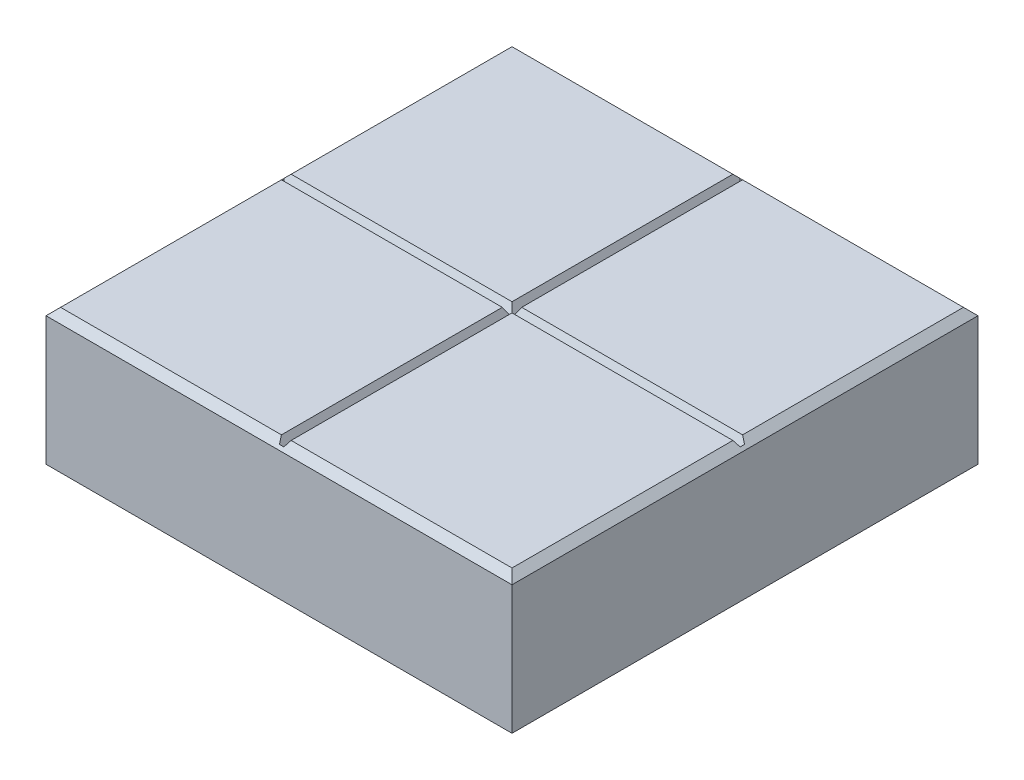
ISO-10303-21;
HEADER;
FILE_DESCRIPTION(('STEP AP214'),'2;1');
FILE_NAME('part.step','',(''),(''),'','','');
FILE_SCHEMA(('AUTOMOTIVE_DESIGN { 1 0 10303 214 1 1 1 1 }'));
ENDSEC;
DATA;
#1=APPLICATION_CONTEXT('core data for automotive mechanical design processes');
#2=APPLICATION_PROTOCOL_DEFINITION('international standard','automotive_design',2000,#1);
#3=PRODUCT_CONTEXT('',#1,'mechanical');
#4=PRODUCT('Part','Part','',(#3));
#5=PRODUCT_RELATED_PRODUCT_CATEGORY('part','',(#4));
#6=PRODUCT_DEFINITION_FORMATION('','',#4);
#7=PRODUCT_DEFINITION_CONTEXT('part definition',#1,'design');
#8=PRODUCT_DEFINITION('design','',#6,#7);
#9=PRODUCT_DEFINITION_SHAPE('','',#8);
#10=(LENGTH_UNIT() NAMED_UNIT(*) SI_UNIT(.MILLI.,.METRE.));
#11=(NAMED_UNIT(*) PLANE_ANGLE_UNIT() SI_UNIT($,.RADIAN.));
#12=(NAMED_UNIT(*) SI_UNIT($,.STERADIAN.) SOLID_ANGLE_UNIT());
#13=UNCERTAINTY_MEASURE_WITH_UNIT(LENGTH_MEASURE(1.E-05),#10,'distance_accuracy_value','');
#14=(GEOMETRIC_REPRESENTATION_CONTEXT(3) GLOBAL_UNCERTAINTY_ASSIGNED_CONTEXT((#13)) GLOBAL_UNIT_ASSIGNED_CONTEXT((#10,
#11,#12)) REPRESENTATION_CONTEXT('',''));
#15=CARTESIAN_POINT('',(0.,0.,0.));
#16=DIRECTION('',(0.,0.,1.));
#17=DIRECTION('',(1.,0.,0.));
#18=AXIS2_PLACEMENT_3D('',#15,#16,#17);
#19=CARTESIAN_POINT('',(0.,70.,0.));
#20=DIRECTION('',(0.,-1.,0.));
#21=DIRECTION('',(0.,0.,-1.));
#22=AXIS2_PLACEMENT_3D('',#19,#20,#21);
#23=PLANE('',#22);
#24=DIRECTION('',(0.,0.,1.));
#25=VECTOR('',#24,1.);
#26=CARTESIAN_POINT('',(116.25,70.,-130.));
#27=LINE('',#26,#25);
#28=CARTESIAN_POINT('',(116.25,70.,-116.249999999999));
#29=VERTEX_POINT('',#28);
#30=CARTESIAN_POINT('',(116.25,70.,-2.5));
#31=VERTEX_POINT('',#30);
#32=EDGE_CURVE('E203',#29,#31,#27,.T.);
#33=ORIENTED_EDGE('',*,*,#32,.F.);
#34=DIRECTION('',(1.,0.,0.));
#35=VECTOR('',#34,1.);
#36=CARTESIAN_POINT('',(-130.,70.,-116.25));
#37=LINE('',#36,#35);
#38=CARTESIAN_POINT('',(2.5,70.,-116.25));
#39=VERTEX_POINT('',#38);
#40=EDGE_CURVE('E390',#39,#29,#37,.T.);
#41=ORIENTED_EDGE('',*,*,#40,.F.);
#42=DIRECTION('',(0.,0.,-1.));
#43=VECTOR('',#42,1.);
#44=CARTESIAN_POINT('',(2.5,70.,0.));
#45=LINE('',#44,#43);
#46=CARTESIAN_POINT('',(2.5,70.,-2.5));
#47=VERTEX_POINT('',#46);
#48=EDGE_CURVE('E318',#47,#39,#45,.T.);
#49=ORIENTED_EDGE('',*,*,#48,.F.);
#50=DIRECTION('',(1.,0.,0.));
#51=VECTOR('',#50,1.);
#52=CARTESIAN_POINT('',(0.,70.,-2.5));
#53=LINE('',#52,#51);
#54=EDGE_CURVE('E325',#47,#31,#53,.T.);
#55=ORIENTED_EDGE('',*,*,#54,.T.);
#56=EDGE_LOOP('',(#33,#41,#49,#55));
#57=FACE_BOUND('',#56,.T.);
#58=ADVANCED_FACE('F44',(#57),#23,.F.);
#59=DIRECTION('',(0.,0.,-1.));
#60=VECTOR('',#59,1.);
#61=CARTESIAN_POINT('',(-116.25,70.,130.));
#62=LINE('',#61,#60);
#63=CARTESIAN_POINT('',(-116.25,70.,116.249999999999));
#64=VERTEX_POINT('',#63);
#65=CARTESIAN_POINT('',(-116.25,70.,2.5));
#66=VERTEX_POINT('',#65);
#67=EDGE_CURVE('E245',#64,#66,#62,.T.);
#68=ORIENTED_EDGE('',*,*,#67,.F.);
#69=DIRECTION('',(-1.,0.,0.));
#70=VECTOR('',#69,1.);
#71=CARTESIAN_POINT('',(129.999999999999,70.,116.250000000001));
#72=LINE('',#71,#70);
#73=CARTESIAN_POINT('',(-2.49999999999996,70.,116.25));
#74=VERTEX_POINT('',#73);
#75=EDGE_CURVE('E60',#74,#64,#72,.T.);
#76=ORIENTED_EDGE('',*,*,#75,.F.);
#77=DIRECTION('',(0.,0.,-1.));
#78=VECTOR('',#77,1.);
#79=CARTESIAN_POINT('',(-2.5,70.,0.));
#80=LINE('',#79,#78);
#81=CARTESIAN_POINT('',(-2.5,70.,2.5));
#82=VERTEX_POINT('',#81);
#83=EDGE_CURVE('E336',#74,#82,#80,.T.);
#84=ORIENTED_EDGE('',*,*,#83,.T.);
#85=DIRECTION('',(1.,0.,0.));
#86=VECTOR('',#85,1.);
#87=CARTESIAN_POINT('',(0.,70.,2.5));
#88=LINE('',#87,#86);
#89=EDGE_CURVE('E339',#66,#82,#88,.T.);
#90=ORIENTED_EDGE('',*,*,#89,.F.);
#91=EDGE_LOOP('',(#68,#76,#84,#90));
#92=FACE_BOUND('',#91,.T.);
#93=ADVANCED_FACE('F449',(#92),#23,.F.);
#94=DIRECTION('',(0.,0.,-1.));
#95=VECTOR('',#94,1.);
#96=CARTESIAN_POINT('',(-2.5,70.,0.));
#97=LINE('',#96,#95);
#98=CARTESIAN_POINT('',(-2.5,70.,-2.5));
#99=VERTEX_POINT('',#98);
#100=CARTESIAN_POINT('',(-2.5,70.,-116.25));
#101=VERTEX_POINT('',#100);
#102=EDGE_CURVE('E346',#99,#101,#97,.T.);
#103=ORIENTED_EDGE('',*,*,#102,.T.);
#104=CARTESIAN_POINT('',(-116.25,70.,-116.25));
#105=VERTEX_POINT('',#104);
#106=EDGE_CURVE('E389',#105,#101,#37,.T.);
#107=ORIENTED_EDGE('',*,*,#106,.F.);
#108=CARTESIAN_POINT('',(-116.25,70.,-2.5));
#109=VERTEX_POINT('',#108);
#110=EDGE_CURVE('E236',#109,#105,#62,.T.);
#111=ORIENTED_EDGE('',*,*,#110,.F.);
#112=DIRECTION('',(1.,0.,0.));
#113=VECTOR('',#112,1.);
#114=CARTESIAN_POINT('',(0.,70.,-2.5));
#115=LINE('',#114,#113);
#116=EDGE_CURVE('E343',#109,#99,#115,.T.);
#117=ORIENTED_EDGE('',*,*,#116,.T.);
#118=EDGE_LOOP('',(#103,#107,#111,#117));
#119=FACE_BOUND('',#118,.T.);
#120=ADVANCED_FACE('F455',(#119),#23,.F.);
#121=CARTESIAN_POINT('',(120.,70.,120.));
#122=DIRECTION('',(-1.,0.,0.));
#123=DIRECTION('',(0.,0.,1.));
#124=AXIS2_PLACEMENT_3D('',#121,#122,#123);
#125=PLANE('',#124);
#126=DIRECTION('',(0.,-1.,0.));
#127=VECTOR('',#126,1.);
#128=CARTESIAN_POINT('',(120.,70.,-120.));
#129=LINE('',#128,#127);
#130=CARTESIAN_POINT('',(120.,66.25,-120.));
#131=VERTEX_POINT('',#130);
#132=CARTESIAN_POINT('',(120.,0.,-120.));
#133=VERTEX_POINT('',#132);
#134=EDGE_CURVE('E200',#131,#133,#129,.T.);
#135=ORIENTED_EDGE('',*,*,#134,.F.);
#136=DIRECTION('',(0.,0.,-1.));
#137=VECTOR('',#136,1.);
#138=CARTESIAN_POINT('',(120.,66.25,-130.));
#139=LINE('',#138,#137);
#140=CARTESIAN_POINT('',(120.,66.25,120.000000000001));
#141=VERTEX_POINT('',#140);
#142=EDGE_CURVE('E189',#141,#131,#139,.T.);
#143=ORIENTED_EDGE('',*,*,#142,.F.);
#144=DIRECTION('',(0.,-1.,0.));
#145=VECTOR('',#144,1.);
#146=CARTESIAN_POINT('',(120.,70.,120.));
#147=LINE('',#146,#145);
#148=CARTESIAN_POINT('',(120.,0.,120.));
#149=VERTEX_POINT('',#148);
#150=EDGE_CURVE('E198',#141,#149,#147,.T.);
#151=ORIENTED_EDGE('',*,*,#150,.T.);
#152=DIRECTION('',(0.,0.,-1.));
#153=VECTOR('',#152,1.);
#154=CARTESIAN_POINT('',(120.,0.,120.));
#155=LINE('',#154,#153);
#156=EDGE_CURVE('E255',#149,#133,#155,.T.);
#157=ORIENTED_EDGE('',*,*,#156,.T.);
#158=EDGE_LOOP('',(#135,#143,#151,#157));
#159=FACE_BOUND('',#158,.T.);
#160=ADVANCED_FACE('F46',(#159),#125,.F.);
#161=CARTESIAN_POINT('',(-120.,70.,-120.));
#162=DIRECTION('',(0.,0.,1.));
#163=DIRECTION('',(1.,0.,0.));
#164=AXIS2_PLACEMENT_3D('',#161,#162,#163);
#165=PLANE('',#164);
#166=DIRECTION('',(0.,-1.,0.));
#167=VECTOR('',#166,1.);
#168=CARTESIAN_POINT('',(-120.,70.,-120.));
#169=LINE('',#168,#167);
#170=CARTESIAN_POINT('',(-120.,66.25,-120.));
#171=VERTEX_POINT('',#170);
#172=CARTESIAN_POINT('',(-120.,0.,-120.));
#173=VERTEX_POINT('',#172);
#174=EDGE_CURVE('E214',#171,#173,#169,.T.);
#175=ORIENTED_EDGE('',*,*,#174,.F.);
#176=DIRECTION('',(-1.,0.,0.));
#177=VECTOR('',#176,1.);
#178=CARTESIAN_POINT('',(-130.,66.25,-120.));
#179=LINE('',#178,#177);
#180=EDGE_CURVE('E249',#131,#171,#179,.T.);
#181=ORIENTED_EDGE('',*,*,#180,.F.);
#182=ORIENTED_EDGE('',*,*,#134,.T.);
#183=DIRECTION('',(-1.,0.,0.));
#184=VECTOR('',#183,1.);
#185=CARTESIAN_POINT('',(-120.,0.,-120.));
#186=LINE('',#185,#184);
#187=EDGE_CURVE('E251',#133,#173,#186,.T.);
#188=ORIENTED_EDGE('',*,*,#187,.T.);
#189=EDGE_LOOP('',(#175,#181,#182,#188));
#190=FACE_BOUND('',#189,.T.);
#191=ADVANCED_FACE('F248',(#190),#165,.F.);
#192=CARTESIAN_POINT('',(-120.,70.,120.));
#193=DIRECTION('',(1.,0.,0.));
#194=DIRECTION('',(0.,0.,-1.));
#195=AXIS2_PLACEMENT_3D('',#192,#193,#194);
#196=PLANE('',#195);
#197=DIRECTION('',(0.,-1.,0.));
#198=VECTOR('',#197,1.);
#199=CARTESIAN_POINT('',(-120.,70.,120.));
#200=LINE('',#199,#198);
#201=CARTESIAN_POINT('',(-120.,66.25,119.999999999999));
#202=VERTEX_POINT('',#201);
#203=CARTESIAN_POINT('',(-120.,0.,120.));
#204=VERTEX_POINT('',#203);
#205=EDGE_CURVE('E210',#202,#204,#200,.T.);
#206=ORIENTED_EDGE('',*,*,#205,.F.);
#207=DIRECTION('',(0.,0.,1.));
#208=VECTOR('',#207,1.);
#209=CARTESIAN_POINT('',(-120.,66.25,130.));
#210=LINE('',#209,#208);
#211=EDGE_CURVE('E233',#171,#202,#210,.T.);
#212=ORIENTED_EDGE('',*,*,#211,.F.);
#213=ORIENTED_EDGE('',*,*,#174,.T.);
#214=DIRECTION('',(0.,0.,1.));
#215=VECTOR('',#214,1.);
#216=CARTESIAN_POINT('',(-120.,0.,120.));
#217=LINE('',#216,#215);
#218=EDGE_CURVE('E216',#173,#204,#217,.T.);
#219=ORIENTED_EDGE('',*,*,#218,.T.);
#220=EDGE_LOOP('',(#206,#212,#213,#219));
#221=FACE_BOUND('',#220,.T.);
#222=ADVANCED_FACE('F241',(#221),#196,.F.);
#223=CARTESIAN_POINT('',(-120.,70.,120.));
#224=DIRECTION('',(0.,0.,-1.));
#225=DIRECTION('',(-1.,0.,0.));
#226=AXIS2_PLACEMENT_3D('',#223,#224,#225);
#227=PLANE('',#226);
#228=ORIENTED_EDGE('',*,*,#150,.F.);
#229=DIRECTION('',(1.,0.,0.));
#230=VECTOR('',#229,1.);
#231=CARTESIAN_POINT('',(129.999999999999,66.25,120.000000000001));
#232=LINE('',#231,#230);
#233=EDGE_CURVE('E172',#202,#141,#232,.T.);
#234=ORIENTED_EDGE('',*,*,#233,.F.);
#235=ORIENTED_EDGE('',*,*,#205,.T.);
#236=DIRECTION('',(1.,0.,0.));
#237=VECTOR('',#236,1.);
#238=CARTESIAN_POINT('',(-120.,0.,120.));
#239=LINE('',#238,#237);
#240=EDGE_CURVE('E207',#204,#149,#239,.T.);
#241=ORIENTED_EDGE('',*,*,#240,.T.);
#242=EDGE_LOOP('',(#228,#234,#235,#241));
#243=FACE_BOUND('',#242,.T.);
#244=ADVANCED_FACE('F205',(#243),#227,.F.);
#245=DIRECTION('',(0.,0.,-1.));
#246=VECTOR('',#245,1.);
#247=CARTESIAN_POINT('',(2.5,70.,0.));
#248=LINE('',#247,#246);
#249=CARTESIAN_POINT('',(2.5,70.,116.25));
#250=VERTEX_POINT('',#249);
#251=CARTESIAN_POINT('',(2.5,70.,2.5));
#252=VERTEX_POINT('',#251);
#253=EDGE_CURVE('E333',#250,#252,#248,.T.);
#254=ORIENTED_EDGE('',*,*,#253,.F.);
#255=CARTESIAN_POINT('',(116.25,70.,116.250000000001));
#256=VERTEX_POINT('',#255);
#257=EDGE_CURVE('E182',#256,#250,#72,.T.);
#258=ORIENTED_EDGE('',*,*,#257,.F.);
#259=CARTESIAN_POINT('',(116.25,70.,2.49999999999997));
#260=VERTEX_POINT('',#259);
#261=EDGE_CURVE('E192',#260,#256,#27,.T.);
#262=ORIENTED_EDGE('',*,*,#261,.F.);
#263=DIRECTION('',(1.,0.,0.));
#264=VECTOR('',#263,1.);
#265=CARTESIAN_POINT('',(0.,70.,2.5));
#266=LINE('',#265,#264);
#267=EDGE_CURVE('E329',#252,#260,#266,.T.);
#268=ORIENTED_EDGE('',*,*,#267,.F.);
#269=EDGE_LOOP('',(#254,#258,#262,#268));
#270=FACE_BOUND('',#269,.T.);
#271=ADVANCED_FACE('F406',(#270),#23,.F.);
#272=CARTESIAN_POINT('',(0.,0.,0.));
#273=DIRECTION('',(0.,-1.,0.));
#274=DIRECTION('',(0.,0.,-1.));
#275=AXIS2_PLACEMENT_3D('',#272,#273,#274);
#276=PLANE('',#275);
#277=ORIENTED_EDGE('',*,*,#156,.F.);
#278=ORIENTED_EDGE('',*,*,#240,.F.);
#279=ORIENTED_EDGE('',*,*,#218,.F.);
#280=ORIENTED_EDGE('',*,*,#187,.F.);
#281=EDGE_LOOP('',(#277,#278,#279,#280));
#282=FACE_BOUND('',#281,.T.);
#283=ADVANCED_FACE('F257',(#282),#276,.T.);
#284=CARTESIAN_POINT('',(-2.5,70.,0.));
#285=DIRECTION('',(-0.866025403784438,-0.5,0.));
#286=DIRECTION('',(0.5,-0.866025403784438,0.));
#287=AXIS2_PLACEMENT_3D('',#284,#285,#286);
#288=PLANE('',#287);
#289=DIRECTION('',(-0.377964473009227,0.654653670707977,0.654653670707978));
#290=VECTOR('',#289,1.);
#291=CARTESIAN_POINT('',(-31.264415197126,119.821428571429,-66.4285714285713));
#292=LINE('',#291,#290);
#293=CARTESIAN_POINT('',(-1.12740473580836,67.6225952641917,-118.627404735808));
#294=VERTEX_POINT('',#293);
#295=EDGE_CURVE('E365',#101,#294,#292,.F.);
#296=ORIENTED_EDGE('',*,*,#295,.F.);
#297=ORIENTED_EDGE('',*,*,#102,.F.);
#298=DIRECTION('',(-0.447213595499958,0.774596669241483,-0.447213595499958));
#299=VECTOR('',#298,1.);
#300=CARTESIAN_POINT('',(-2.,69.1339745962156,-2.));
#301=LINE('',#300,#299);
#302=CARTESIAN_POINT('',(0.,65.6698729810778,0.));
#303=VERTEX_POINT('',#302);
#304=EDGE_CURVE('E314',#303,#99,#301,.T.);
#305=ORIENTED_EDGE('',*,*,#304,.F.);
#306=DIRECTION('',(0.,0.,1.));
#307=VECTOR('',#306,1.);
#308=CARTESIAN_POINT('',(0.,65.6698729810778,0.));
#309=LINE('',#308,#307);
#310=CARTESIAN_POINT('',(0.,65.6698729810778,-117.5));
#311=VERTEX_POINT('',#310);
#312=EDGE_CURVE('E271',#303,#311,#309,.F.);
#313=ORIENTED_EDGE('',*,*,#312,.T.);
#314=DIRECTION('',(0.447213595499958,-0.774596669241483,0.447213595499958));
#315=VECTOR('',#314,1.);
#316=CARTESIAN_POINT('',(21.5,28.430780618347,-95.9999999999999));
#317=LINE('',#316,#315);
#318=EDGE_CURVE('E274',#311,#294,#317,.F.);
#319=ORIENTED_EDGE('',*,*,#318,.T.);
#320=EDGE_LOOP('',(#296,#297,#305,#313,#319));
#321=FACE_BOUND('',#320,.T.);
#322=ADVANCED_FACE('F425',(#321),#288,.F.);
#323=CARTESIAN_POINT('',(0.,70.,-120.));
#324=DIRECTION('',(0.,-0.5,-0.866025403784438));
#325=DIRECTION('',(0.,0.866025403784438,-0.5));
#326=AXIS2_PLACEMENT_3D('',#323,#324,#325);
#327=PLANE('',#326);
#328=DIRECTION('',(0.447213595499958,0.774596669241483,-0.447213595499958));
#329=VECTOR('',#328,1.);
#330=CARTESIAN_POINT('',(-21.5,28.430780618347,-95.9999999999999));
#331=LINE('',#330,#329);
#332=CARTESIAN_POINT('',(1.12740473580834,67.6225952641916,-118.627404735808));
#333=VERTEX_POINT('',#332);
#334=EDGE_CURVE('E275',#311,#333,#331,.T.);
#335=ORIENTED_EDGE('',*,*,#334,.T.);
#336=DIRECTION('',(-1.,0.,0.));
#337=VECTOR('',#336,1.);
#338=CARTESIAN_POINT('',(0.,67.6225952641917,-118.627404735808));
#339=LINE('',#338,#337);
#340=EDGE_CURVE('E368',#333,#294,#339,.T.);
#341=ORIENTED_EDGE('',*,*,#340,.T.);
#342=ORIENTED_EDGE('',*,*,#318,.F.);
#343=EDGE_LOOP('',(#335,#341,#342));
#344=FACE_BOUND('',#343,.T.);
#345=ADVANCED_FACE('F477',(#344),#327,.F.);
#346=CARTESIAN_POINT('',(2.5,70.,0.));
#347=DIRECTION('',(0.866025403784438,-0.5,0.));
#348=DIRECTION('',(0.5,0.866025403784438,0.));
#349=AXIS2_PLACEMENT_3D('',#346,#347,#348);
#350=PLANE('',#349);
#351=ORIENTED_EDGE('',*,*,#48,.T.);
#352=DIRECTION('',(-0.377964473009227,-0.654653670707976,-0.654653670707979));
#353=VECTOR('',#352,1.);
#354=CARTESIAN_POINT('',(31.264415197126,119.821428571429,-66.4285714285711));
#355=LINE('',#354,#353);
#356=EDGE_CURVE('E372',#39,#333,#355,.T.);
#357=ORIENTED_EDGE('',*,*,#356,.T.);
#358=ORIENTED_EDGE('',*,*,#334,.F.);
#359=ORIENTED_EDGE('',*,*,#312,.F.);
#360=DIRECTION('',(-0.447213595499958,-0.774596669241483,0.447213595499958));
#361=VECTOR('',#360,1.);
#362=CARTESIAN_POINT('',(2.,69.1339745962156,-2.));
#363=LINE('',#362,#361);
#364=EDGE_CURVE('E279',#303,#47,#363,.F.);
#365=ORIENTED_EDGE('',*,*,#364,.T.);
#366=EDGE_LOOP('',(#351,#357,#358,#359,#365));
#367=FACE_BOUND('',#366,.T.);
#368=ADVANCED_FACE('F474',(#367),#350,.F.);
#369=CARTESIAN_POINT('',(0.,70.,-2.5));
#370=DIRECTION('',(0.,-0.5,-0.866025403784438));
#371=DIRECTION('',(0.,0.866025403784438,-0.5));
#372=AXIS2_PLACEMENT_3D('',#369,#370,#371);
#373=PLANE('',#372);
#374=DIRECTION('',(-0.654653670707978,0.654653670707976,-0.377964473009227));
#375=VECTOR('',#374,1.);
#376=CARTESIAN_POINT('',(66.4285714285712,119.821428571429,-31.264415197126));
#377=LINE('',#376,#375);
#378=CARTESIAN_POINT('',(118.627404735808,67.6225952641916,-1.12740473580832));
#379=VERTEX_POINT('',#378);
#380=EDGE_CURVE('E358',#31,#379,#377,.F.);
#381=ORIENTED_EDGE('',*,*,#380,.F.);
#382=ORIENTED_EDGE('',*,*,#54,.F.);
#383=ORIENTED_EDGE('',*,*,#364,.F.);
#384=DIRECTION('',(-1.,0.,0.));
#385=VECTOR('',#384,1.);
#386=CARTESIAN_POINT('',(0.,65.6698729810778,0.));
#387=LINE('',#386,#385);
#388=CARTESIAN_POINT('',(117.5,65.6698729810778,0.));
#389=VERTEX_POINT('',#388);
#390=EDGE_CURVE('E268',#303,#389,#387,.F.);
#391=ORIENTED_EDGE('',*,*,#390,.T.);
#392=DIRECTION('',(-0.447213595499958,-0.774596669241483,0.447213595499958));
#393=VECTOR('',#392,1.);
#394=CARTESIAN_POINT('',(96.,28.4307806183469,21.5));
#395=LINE('',#394,#393);
#396=EDGE_CURVE('E282',#389,#379,#395,.F.);
#397=ORIENTED_EDGE('',*,*,#396,.T.);
#398=EDGE_LOOP('',(#381,#382,#383,#391,#397));
#399=FACE_BOUND('',#398,.T.);
#400=ADVANCED_FACE('F417',(#399),#373,.F.);
#401=CARTESIAN_POINT('',(120.,70.,0.));
#402=DIRECTION('',(0.866025403784438,-0.5,0.));
#403=DIRECTION('',(0.5,0.866025403784438,0.));
#404=AXIS2_PLACEMENT_3D('',#401,#402,#403);
#405=PLANE('',#404);
#406=DIRECTION('',(0.447213595499958,0.774596669241483,0.447213595499958));
#407=VECTOR('',#406,1.);
#408=CARTESIAN_POINT('',(96.,28.4307806183469,-21.5));
#409=LINE('',#408,#407);
#410=CARTESIAN_POINT('',(118.627404735808,67.6225952641916,1.1274047358083));
#411=VERTEX_POINT('',#410);
#412=EDGE_CURVE('E286',#389,#411,#409,.T.);
#413=ORIENTED_EDGE('',*,*,#412,.T.);
#414=DIRECTION('',(0.,0.,-1.));
#415=VECTOR('',#414,1.);
#416=CARTESIAN_POINT('',(118.627404735808,67.6225952641916,0.));
#417=LINE('',#416,#415);
#418=EDGE_CURVE('E361',#411,#379,#417,.T.);
#419=ORIENTED_EDGE('',*,*,#418,.T.);
#420=ORIENTED_EDGE('',*,*,#396,.F.);
#421=EDGE_LOOP('',(#413,#419,#420));
#422=FACE_BOUND('',#421,.T.);
#423=ADVANCED_FACE('F498',(#422),#405,.F.);
#424=CARTESIAN_POINT('',(0.,70.,2.5));
#425=DIRECTION('',(0.,-0.5,0.866025403784438));
#426=DIRECTION('',(0.,-0.866025403784438,-0.5));
#427=AXIS2_PLACEMENT_3D('',#424,#425,#426);
#428=PLANE('',#427);
#429=ORIENTED_EDGE('',*,*,#267,.T.);
#430=DIRECTION('',(0.654653670707978,-0.654653670707976,-0.377964473009227));
#431=VECTOR('',#430,1.);
#432=CARTESIAN_POINT('',(66.4285714285712,119.821428571429,31.264415197126));
#433=LINE('',#432,#431);
#434=EDGE_CURVE('E11',#260,#411,#433,.T.);
#435=ORIENTED_EDGE('',*,*,#434,.T.);
#436=ORIENTED_EDGE('',*,*,#412,.F.);
#437=ORIENTED_EDGE('',*,*,#390,.F.);
#438=DIRECTION('',(0.447213595499958,0.774596669241483,0.447213595499958));
#439=VECTOR('',#438,1.);
#440=CARTESIAN_POINT('',(2.,69.1339745962156,2.));
#441=LINE('',#440,#439);
#442=EDGE_CURVE('E290',#303,#252,#441,.T.);
#443=ORIENTED_EDGE('',*,*,#442,.T.);
#444=EDGE_LOOP('',(#429,#435,#436,#437,#443));
#445=FACE_BOUND('',#444,.T.);
#446=ADVANCED_FACE('F408',(#445),#428,.F.);
#447=CARTESIAN_POINT('',(2.5,70.,0.));
#448=DIRECTION('',(0.866025403784438,-0.5,0.));
#449=DIRECTION('',(0.5,0.866025403784438,0.));
#450=AXIS2_PLACEMENT_3D('',#447,#448,#449);
#451=PLANE('',#450);
#452=DIRECTION('',(0.447213595499958,0.774596669241483,0.447213595499958));
#453=VECTOR('',#452,1.);
#454=CARTESIAN_POINT('',(2.,69.1339745962156,119.5));
#455=LINE('',#454,#453);
#456=CARTESIAN_POINT('',(0.,65.6698729810778,117.5));
#457=VERTEX_POINT('',#456);
#458=CARTESIAN_POINT('',(1.12740473580833,67.6225952641916,118.627404735808));
#459=VERTEX_POINT('',#458);
#460=EDGE_CURVE('E294',#457,#459,#455,.T.);
#461=ORIENTED_EDGE('',*,*,#460,.T.);
#462=DIRECTION('',(0.377964473009228,0.654653670707978,-0.654653670707976));
#463=VECTOR('',#462,1.);
#464=CARTESIAN_POINT('',(31.264415197126,119.821428571429,66.4285714285716));
#465=LINE('',#464,#463);
#466=EDGE_CURVE('E376',#459,#250,#465,.T.);
#467=ORIENTED_EDGE('',*,*,#466,.T.);
#468=ORIENTED_EDGE('',*,*,#253,.T.);
#469=ORIENTED_EDGE('',*,*,#442,.F.);
#470=DIRECTION('',(0.,0.,-1.));
#471=VECTOR('',#470,1.);
#472=CARTESIAN_POINT('',(0.,65.6698729810778,0.));
#473=LINE('',#472,#471);
#474=EDGE_CURVE('E265',#303,#457,#473,.F.);
#475=ORIENTED_EDGE('',*,*,#474,.T.);
#476=EDGE_LOOP('',(#461,#467,#468,#469,#475));
#477=FACE_BOUND('',#476,.T.);
#478=ADVANCED_FACE('F402',(#477),#451,.F.);
#479=CARTESIAN_POINT('',(0.,70.,120.));
#480=DIRECTION('',(0.,-0.5,0.866025403784438));
#481=DIRECTION('',(0.,-0.866025403784438,-0.5));
#482=AXIS2_PLACEMENT_3D('',#479,#480,#481);
#483=PLANE('',#482);
#484=DIRECTION('',(0.447213595499958,-0.774596669241483,-0.447213595499958));
#485=VECTOR('',#484,1.);
#486=CARTESIAN_POINT('',(-2.,69.1339745962156,119.5));
#487=LINE('',#486,#485);
#488=CARTESIAN_POINT('',(-1.12740473580831,67.6225952641916,118.627404735808));
#489=VERTEX_POINT('',#488);
#490=EDGE_CURVE('E298',#457,#489,#487,.F.);
#491=ORIENTED_EDGE('',*,*,#490,.T.);
#492=DIRECTION('',(1.,0.,0.));
#493=VECTOR('',#492,1.);
#494=CARTESIAN_POINT('',(0.,67.6225952641916,118.627404735808));
#495=LINE('',#494,#493);
#496=EDGE_CURVE('E380',#489,#459,#495,.T.);
#497=ORIENTED_EDGE('',*,*,#496,.T.);
#498=ORIENTED_EDGE('',*,*,#460,.F.);
#499=EDGE_LOOP('',(#491,#497,#498));
#500=FACE_BOUND('',#499,.T.);
#501=ADVANCED_FACE('F505',(#500),#483,.F.);
#502=CARTESIAN_POINT('',(-2.5,70.,0.));
#503=DIRECTION('',(-0.866025403784438,-0.5,0.));
#504=DIRECTION('',(0.5,-0.866025403784438,0.));
#505=AXIS2_PLACEMENT_3D('',#502,#503,#504);
#506=PLANE('',#505);
#507=DIRECTION('',(0.377964473009226,-0.654653670707974,0.654653670707981));
#508=VECTOR('',#507,1.);
#509=CARTESIAN_POINT('',(-31.264415197126,119.821428571429,66.4285714285708));
#510=LINE('',#509,#508);
#511=EDGE_CURVE('E384',#489,#74,#510,.F.);
#512=ORIENTED_EDGE('',*,*,#511,.F.);
#513=ORIENTED_EDGE('',*,*,#490,.F.);
#514=ORIENTED_EDGE('',*,*,#474,.F.);
#515=DIRECTION('',(0.447213595499958,-0.774596669241483,-0.447213595499958));
#516=VECTOR('',#515,1.);
#517=CARTESIAN_POINT('',(-2.,69.1339745962156,2.));
#518=LINE('',#517,#516);
#519=EDGE_CURVE('E302',#303,#82,#518,.F.);
#520=ORIENTED_EDGE('',*,*,#519,.T.);
#521=ORIENTED_EDGE('',*,*,#83,.F.);
#522=EDGE_LOOP('',(#512,#513,#514,#520,#521));
#523=FACE_BOUND('',#522,.T.);
#524=ADVANCED_FACE('F444',(#523),#506,.F.);
#525=DIRECTION('',(-0.447213595499958,0.774596669241483,0.447213595499958));
#526=VECTOR('',#525,1.);
#527=CARTESIAN_POINT('',(-119.5,69.1339745962156,2.));
#528=LINE('',#527,#526);
#529=CARTESIAN_POINT('',(-117.5,65.6698729810778,0.));
#530=VERTEX_POINT('',#529);
#531=CARTESIAN_POINT('',(-118.627404735808,67.6225952641917,1.12740473580836));
#532=VERTEX_POINT('',#531);
#533=EDGE_CURVE('E306',#530,#532,#528,.T.);
#534=ORIENTED_EDGE('',*,*,#533,.T.);
#535=DIRECTION('',(0.654653670707978,0.654653670707976,0.377964473009227));
#536=VECTOR('',#535,1.);
#537=CARTESIAN_POINT('',(-66.4285714285712,119.821428571429,31.264415197126));
#538=LINE('',#537,#536);
#539=EDGE_CURVE('E350',#532,#66,#538,.T.);
#540=ORIENTED_EDGE('',*,*,#539,.T.);
#541=ORIENTED_EDGE('',*,*,#89,.T.);
#542=ORIENTED_EDGE('',*,*,#519,.F.);
#543=DIRECTION('',(1.,0.,0.));
#544=VECTOR('',#543,1.);
#545=CARTESIAN_POINT('',(0.,65.6698729810778,0.));
#546=LINE('',#545,#544);
#547=EDGE_CURVE('E262',#303,#530,#546,.F.);
#548=ORIENTED_EDGE('',*,*,#547,.T.);
#549=EDGE_LOOP('',(#534,#540,#541,#542,#548));
#550=FACE_BOUND('',#549,.T.);
#551=ADVANCED_FACE('F434',(#550),#428,.F.);
#552=CARTESIAN_POINT('',(-120.,70.,0.));
#553=DIRECTION('',(-0.866025403784438,-0.5,0.));
#554=DIRECTION('',(0.5,-0.866025403784438,0.));
#555=AXIS2_PLACEMENT_3D('',#552,#553,#554);
#556=PLANE('',#555);
#557=DIRECTION('',(0.447213595499958,-0.774596669241483,0.447213595499958));
#558=VECTOR('',#557,1.);
#559=CARTESIAN_POINT('',(-119.5,69.1339745962156,-2.));
#560=LINE('',#559,#558);
#561=CARTESIAN_POINT('',(-118.627404735808,67.6225952641916,-1.12740473580835));
#562=VERTEX_POINT('',#561);
#563=EDGE_CURVE('E310',#530,#562,#560,.F.);
#564=ORIENTED_EDGE('',*,*,#563,.T.);
#565=DIRECTION('',(0.,0.,1.));
#566=VECTOR('',#565,1.);
#567=CARTESIAN_POINT('',(-118.627404735808,67.6225952641917,0.));
#568=LINE('',#567,#566);
#569=EDGE_CURVE('E68',#562,#532,#568,.T.);
#570=ORIENTED_EDGE('',*,*,#569,.T.);
#571=ORIENTED_EDGE('',*,*,#533,.F.);
#572=EDGE_LOOP('',(#564,#570,#571));
#573=FACE_BOUND('',#572,.T.);
#574=ADVANCED_FACE('F436',(#573),#556,.F.);
#575=DIRECTION('',(-0.654653670707978,-0.654653670707976,0.377964473009227));
#576=VECTOR('',#575,1.);
#577=CARTESIAN_POINT('',(-66.4285714285712,119.821428571429,-31.264415197126));
#578=LINE('',#577,#576);
#579=EDGE_CURVE('E224',#562,#109,#578,.F.);
#580=ORIENTED_EDGE('',*,*,#579,.F.);
#581=ORIENTED_EDGE('',*,*,#563,.F.);
#582=ORIENTED_EDGE('',*,*,#547,.F.);
#583=ORIENTED_EDGE('',*,*,#304,.T.);
#584=ORIENTED_EDGE('',*,*,#116,.F.);
#585=EDGE_LOOP('',(#580,#581,#582,#583,#584));
#586=FACE_BOUND('',#585,.T.);
#587=ADVANCED_FACE('F429',(#586),#373,.F.);
#588=CARTESIAN_POINT('',(-116.25,70.,130.));
#589=DIRECTION('',(0.707106781186546,-0.707106781186549,0.));
#590=DIRECTION('',(0.707106781186549,0.707106781186546,0.));
#591=AXIS2_PLACEMENT_3D('',#588,#589,#590);
#592=PLANE('',#591);
#593=ORIENTED_EDGE('',*,*,#110,.T.);
#594=DIRECTION('',(-0.577350269189626,-0.577350269189624,-0.577350269189628));
#595=VECTOR('',#594,1.);
#596=CARTESIAN_POINT('',(-34.1666666666662,152.083333333333,-34.1666666666663));
#597=LINE('',#596,#595);
#598=EDGE_CURVE('E53',#105,#171,#597,.T.);
#599=ORIENTED_EDGE('',*,*,#598,.T.);
#600=ORIENTED_EDGE('',*,*,#211,.T.);
#601=DIRECTION('',(0.577350269189629,0.577350269189627,-0.577350269189622));
#602=VECTOR('',#601,1.);
#603=CARTESIAN_POINT('',(-120.833333333334,65.4166666666663,120.833333333332));
#604=LINE('',#603,#602);
#605=EDGE_CURVE('E177',#202,#64,#604,.T.);
#606=ORIENTED_EDGE('',*,*,#605,.T.);
#607=ORIENTED_EDGE('',*,*,#67,.T.);
#608=ORIENTED_EDGE('',*,*,#539,.F.);
#609=ORIENTED_EDGE('',*,*,#569,.F.);
#610=ORIENTED_EDGE('',*,*,#579,.T.);
#611=EDGE_LOOP('',(#593,#599,#600,#606,#607,#608,#609,#610));
#612=FACE_BOUND('',#611,.T.);
#613=ADVANCED_FACE('F232',(#612),#592,.F.);
#614=CARTESIAN_POINT('',(-130.,70.,-116.25));
#615=DIRECTION('',(0.,-0.707106781186549,0.707106781186546));
#616=DIRECTION('',(0.,-0.707106781186546,-0.707106781186549));
#617=AXIS2_PLACEMENT_3D('',#614,#615,#616);
#618=PLANE('',#617);
#619=ORIENTED_EDGE('',*,*,#295,.T.);
#620=ORIENTED_EDGE('',*,*,#340,.F.);
#621=ORIENTED_EDGE('',*,*,#356,.F.);
#622=ORIENTED_EDGE('',*,*,#40,.T.);
#623=DIRECTION('',(0.577350269189627,-0.577350269189625,-0.577350269189625));
#624=VECTOR('',#623,1.);
#625=CARTESIAN_POINT('',(34.1666666666667,152.083333333333,-34.1666666666665));
#626=LINE('',#625,#624);
#627=EDGE_CURVE('E202',#29,#131,#626,.T.);
#628=ORIENTED_EDGE('',*,*,#627,.T.);
#629=ORIENTED_EDGE('',*,*,#180,.T.);
#630=ORIENTED_EDGE('',*,*,#598,.F.);
#631=ORIENTED_EDGE('',*,*,#106,.T.);
#632=EDGE_LOOP('',(#619,#620,#621,#622,#628,#629,#630,#631));
#633=FACE_BOUND('',#632,.T.);
#634=ADVANCED_FACE('F478',(#633),#618,.F.);
#635=CARTESIAN_POINT('',(129.999999999999,70.,116.250000000001));
#636=DIRECTION('',(0.,-0.707106781186549,-0.707106781186546));
#637=DIRECTION('',(0.,0.707106781186546,-0.707106781186549));
#638=AXIS2_PLACEMENT_3D('',#635,#636,#637);
#639=PLANE('',#638);
#640=ORIENTED_EDGE('',*,*,#496,.F.);
#641=ORIENTED_EDGE('',*,*,#511,.T.);
#642=ORIENTED_EDGE('',*,*,#75,.T.);
#643=ORIENTED_EDGE('',*,*,#605,.F.);
#644=ORIENTED_EDGE('',*,*,#233,.T.);
#645=DIRECTION('',(0.577350269189625,-0.577350269189622,0.577350269189631));
#646=VECTOR('',#645,1.);
#647=CARTESIAN_POINT('',(34.1666666666657,152.083333333334,34.1666666666661));
#648=LINE('',#647,#646);
#649=EDGE_CURVE('E175',#256,#141,#648,.T.);
#650=ORIENTED_EDGE('',*,*,#649,.F.);
#651=ORIENTED_EDGE('',*,*,#257,.T.);
#652=ORIENTED_EDGE('',*,*,#466,.F.);
#653=EDGE_LOOP('',(#640,#641,#642,#643,#644,#650,#651,#652));
#654=FACE_BOUND('',#653,.T.);
#655=ADVANCED_FACE('F174',(#654),#639,.F.);
#656=CARTESIAN_POINT('',(116.25,70.,-130.));
#657=DIRECTION('',(-0.707106781186546,-0.707106781186549,0.));
#658=DIRECTION('',(0.707106781186549,-0.707106781186546,0.));
#659=AXIS2_PLACEMENT_3D('',#656,#657,#658);
#660=PLANE('',#659);
#661=ORIENTED_EDGE('',*,*,#380,.T.);
#662=ORIENTED_EDGE('',*,*,#418,.F.);
#663=ORIENTED_EDGE('',*,*,#434,.F.);
#664=ORIENTED_EDGE('',*,*,#261,.T.);
#665=ORIENTED_EDGE('',*,*,#649,.T.);
#666=ORIENTED_EDGE('',*,*,#142,.T.);
#667=ORIENTED_EDGE('',*,*,#627,.F.);
#668=ORIENTED_EDGE('',*,*,#32,.T.);
#669=EDGE_LOOP('',(#661,#662,#663,#664,#665,#666,#667,#668));
#670=FACE_BOUND('',#669,.T.);
#671=ADVANCED_FACE('F187',(#670),#660,.F.);
#672=CLOSED_SHELL('',(#58,#93,#120,#160,#191,#222,#244,#271,#283,#322,#345,#368,#400,#423,#446,
#478,#501,#524,#551,#574,#587,#613,#634,#655,#671));
#673=MANIFOLD_SOLID_BREP('B2',#672);
#674=ADVANCED_BREP_SHAPE_REPRESENTATION('',(#18,#673),#14);
#675=SHAPE_DEFINITION_REPRESENTATION(#9,#674);
ENDSEC;
END-ISO-10303-21;
